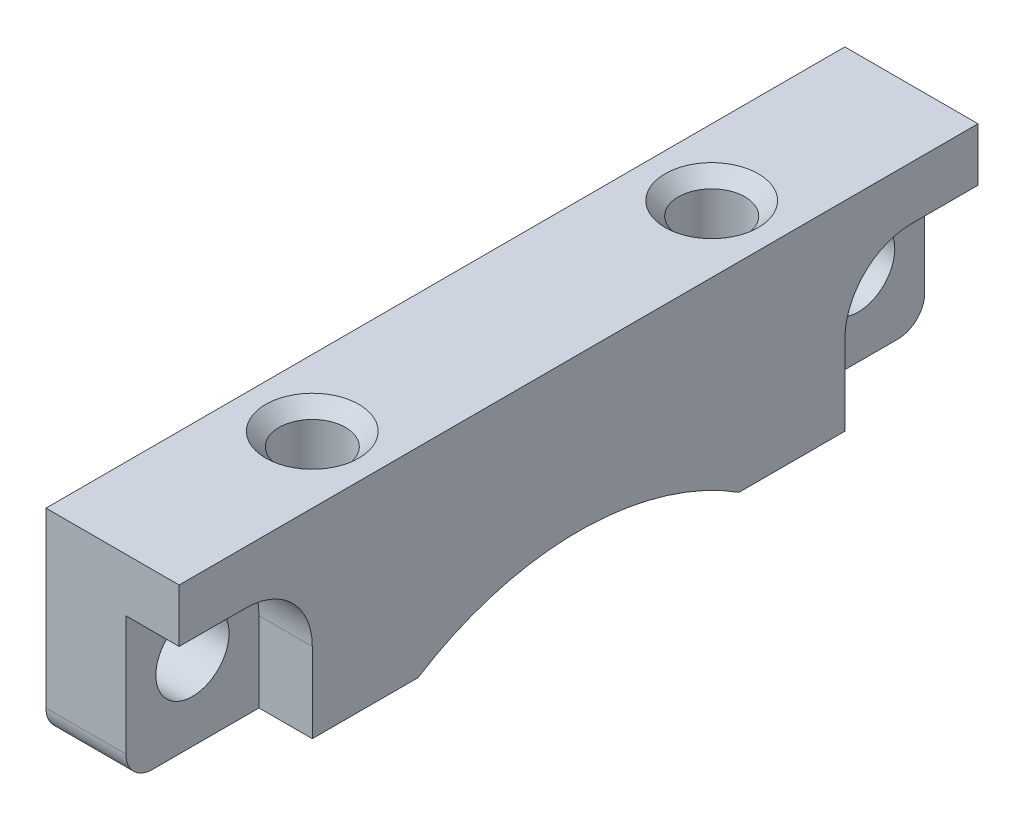
ISO-10303-21;
HEADER;
FILE_DESCRIPTION(('STEP AP214'),'2;1');
FILE_NAME('part.step','',(''),(''),'','','');
FILE_SCHEMA(('AUTOMOTIVE_DESIGN { 1 0 10303 214 1 1 1 1 }'));
ENDSEC;
DATA;
#1=APPLICATION_CONTEXT('core data for automotive mechanical design processes');
#2=APPLICATION_PROTOCOL_DEFINITION('international standard','automotive_design',2000,#1);
#3=PRODUCT_CONTEXT('',#1,'mechanical');
#4=PRODUCT('Part','Part','',(#3));
#5=PRODUCT_RELATED_PRODUCT_CATEGORY('part','',(#4));
#6=PRODUCT_DEFINITION_FORMATION('','',#4);
#7=PRODUCT_DEFINITION_CONTEXT('part definition',#1,'design');
#8=PRODUCT_DEFINITION('design','',#6,#7);
#9=PRODUCT_DEFINITION_SHAPE('','',#8);
#10=(LENGTH_UNIT() NAMED_UNIT(*) SI_UNIT(.MILLI.,.METRE.));
#11=(NAMED_UNIT(*) PLANE_ANGLE_UNIT() SI_UNIT($,.RADIAN.));
#12=(NAMED_UNIT(*) SI_UNIT($,.STERADIAN.) SOLID_ANGLE_UNIT());
#13=UNCERTAINTY_MEASURE_WITH_UNIT(LENGTH_MEASURE(1.E-05),#10,'distance_accuracy_value','');
#14=(GEOMETRIC_REPRESENTATION_CONTEXT(3) GLOBAL_UNCERTAINTY_ASSIGNED_CONTEXT((#13)) GLOBAL_UNIT_ASSIGNED_CONTEXT((#10,
#11,#12)) REPRESENTATION_CONTEXT('',''));
#15=CARTESIAN_POINT('',(0.,0.,0.));
#16=DIRECTION('',(0.,0.,1.));
#17=DIRECTION('',(1.,0.,0.));
#18=AXIS2_PLACEMENT_3D('',#15,#16,#17);
#19=CARTESIAN_POINT('',(10.,25.,25.));
#20=DIRECTION('',(1.,0.,0.));
#21=DIRECTION('',(0.,0.,-1.));
#22=AXIS2_PLACEMENT_3D('',#19,#20,#21);
#23=CYLINDRICAL_SURFACE('',#22,2.74999999999999);
#24=CARTESIAN_POINT('',(0.,25.,25.));
#25=DIRECTION('',(1.,0.,0.));
#26=DIRECTION('',(0.,0.,-1.));
#27=AXIS2_PLACEMENT_3D('',#24,#25,#26);
#28=CIRCLE('',#27,2.75);
#29=CARTESIAN_POINT('',(0.,25.,22.25));
#30=VERTEX_POINT('',#29);
#31=EDGE_CURVE('E289',#30,#30,#28,.T.);
#32=ORIENTED_EDGE('',*,*,#31,.F.);
#33=EDGE_LOOP('',(#32));
#34=FACE_BOUND('',#33,.T.);
#35=CARTESIAN_POINT('',(6.,25.,25.));
#36=DIRECTION('',(1.,0.,0.));
#37=DIRECTION('',(0.,0.,-1.));
#38=AXIS2_PLACEMENT_3D('',#35,#36,#37);
#39=CIRCLE('',#38,2.74999999999999);
#40=CARTESIAN_POINT('',(6.,25.,22.25));
#41=VERTEX_POINT('',#40);
#42=EDGE_CURVE('E217',#41,#41,#39,.F.);
#43=ORIENTED_EDGE('',*,*,#42,.F.);
#44=EDGE_LOOP('',(#43));
#45=FACE_BOUND('',#44,.T.);
#46=ADVANCED_FACE('F57',(#34,#45),#23,.F.);
#47=CARTESIAN_POINT('',(10.,-30.,30.));
#48=DIRECTION('',(0.,0.,-1.));
#49=DIRECTION('',(0.,1.,0.));
#50=AXIS2_PLACEMENT_3D('',#47,#48,#49);
#51=PLANE('',#50);
#52=DIRECTION('',(0.,-1.,0.));
#53=VECTOR('',#52,1.);
#54=CARTESIAN_POINT('',(0.,-30.,30.));
#55=LINE('',#54,#53);
#56=CARTESIAN_POINT('',(0.,34.,30.));
#57=VERTEX_POINT('',#56);
#58=CARTESIAN_POINT('',(0.,21.,30.));
#59=VERTEX_POINT('',#58);
#60=EDGE_CURVE('E311',#57,#59,#55,.T.);
#61=ORIENTED_EDGE('',*,*,#60,.T.);
#62=DIRECTION('',(1.,0.,0.));
#63=VECTOR('',#62,1.);
#64=CARTESIAN_POINT('',(10.,21.,30.));
#65=LINE('',#64,#63);
#66=CARTESIAN_POINT('',(6.,21.,30.));
#67=VERTEX_POINT('',#66);
#68=EDGE_CURVE('E373',#59,#67,#65,.T.);
#69=ORIENTED_EDGE('',*,*,#68,.T.);
#70=DIRECTION('',(0.,-1.,0.));
#71=VECTOR('',#70,1.);
#72=CARTESIAN_POINT('',(6.,30.,30.));
#73=LINE('',#72,#71);
#74=CARTESIAN_POINT('',(6.,30.,30.));
#75=VERTEX_POINT('',#74);
#76=EDGE_CURVE('E189',#75,#67,#73,.T.);
#77=ORIENTED_EDGE('',*,*,#76,.F.);
#78=DIRECTION('',(1.,0.,0.));
#79=VECTOR('',#78,1.);
#80=CARTESIAN_POINT('',(6.,30.,30.));
#81=LINE('',#80,#79);
#82=CARTESIAN_POINT('',(10.,30.,30.));
#83=VERTEX_POINT('',#82);
#84=EDGE_CURVE('E180',#75,#83,#81,.T.);
#85=ORIENTED_EDGE('',*,*,#84,.T.);
#86=DIRECTION('',(0.,-1.,0.));
#87=VECTOR('',#86,1.);
#88=CARTESIAN_POINT('',(10.,-30.,30.));
#89=LINE('',#88,#87);
#90=CARTESIAN_POINT('',(10.,34.,30.));
#91=VERTEX_POINT('',#90);
#92=EDGE_CURVE('E316',#91,#83,#89,.T.);
#93=ORIENTED_EDGE('',*,*,#92,.F.);
#94=DIRECTION('',(-1.,0.,0.));
#95=VECTOR('',#94,1.);
#96=CARTESIAN_POINT('',(10.,34.,30.));
#97=LINE('',#96,#95);
#98=EDGE_CURVE('E327',#91,#57,#97,.T.);
#99=ORIENTED_EDGE('',*,*,#98,.T.);
#100=EDGE_LOOP('',(#61,#69,#77,#85,#93,#99));
#101=FACE_BOUND('',#100,.T.);
#102=ADVANCED_FACE('F436',(#101),#51,.F.);
#103=CARTESIAN_POINT('',(10.,-30.,-30.));
#104=DIRECTION('',(0.,0.,1.));
#105=DIRECTION('',(1.,0.,0.));
#106=AXIS2_PLACEMENT_3D('',#103,#104,#105);
#107=PLANE('',#106);
#108=DIRECTION('',(0.,1.,0.));
#109=VECTOR('',#108,1.);
#110=CARTESIAN_POINT('',(6.,30.,-30.));
#111=LINE('',#110,#109);
#112=CARTESIAN_POINT('',(6.,21.,-30.));
#113=VERTEX_POINT('',#112);
#114=CARTESIAN_POINT('',(6.,30.,-30.));
#115=VERTEX_POINT('',#114);
#116=EDGE_CURVE('E251',#113,#115,#111,.T.);
#117=ORIENTED_EDGE('',*,*,#116,.F.);
#118=DIRECTION('',(-1.,0.,0.));
#119=VECTOR('',#118,1.);
#120=CARTESIAN_POINT('',(10.,21.,-30.));
#121=LINE('',#120,#119);
#122=CARTESIAN_POINT('',(0.,21.,-30.));
#123=VERTEX_POINT('',#122);
#124=EDGE_CURVE('E351',#113,#123,#121,.T.);
#125=ORIENTED_EDGE('',*,*,#124,.T.);
#126=DIRECTION('',(0.,1.,0.));
#127=VECTOR('',#126,1.);
#128=CARTESIAN_POINT('',(0.,-30.,-30.));
#129=LINE('',#128,#127);
#130=CARTESIAN_POINT('',(0.,34.,-30.));
#131=VERTEX_POINT('',#130);
#132=EDGE_CURVE('E331',#123,#131,#129,.T.);
#133=ORIENTED_EDGE('',*,*,#132,.T.);
#134=DIRECTION('',(-1.,0.,0.));
#135=VECTOR('',#134,1.);
#136=CARTESIAN_POINT('',(10.,34.,-30.));
#137=LINE('',#136,#135);
#138=CARTESIAN_POINT('',(10.,34.,-30.));
#139=VERTEX_POINT('',#138);
#140=EDGE_CURVE('E339',#139,#131,#137,.T.);
#141=ORIENTED_EDGE('',*,*,#140,.F.);
#142=DIRECTION('',(0.,1.,0.));
#143=VECTOR('',#142,1.);
#144=CARTESIAN_POINT('',(10.,-30.,-30.));
#145=LINE('',#144,#143);
#146=CARTESIAN_POINT('',(10.,30.,-30.));
#147=VERTEX_POINT('',#146);
#148=EDGE_CURVE('E320',#147,#139,#145,.T.);
#149=ORIENTED_EDGE('',*,*,#148,.F.);
#150=DIRECTION('',(1.,0.,0.));
#151=VECTOR('',#150,1.);
#152=CARTESIAN_POINT('',(6.,30.,-30.));
#153=LINE('',#152,#151);
#154=EDGE_CURVE('E231',#115,#147,#153,.T.);
#155=ORIENTED_EDGE('',*,*,#154,.F.);
#156=EDGE_LOOP('',(#117,#125,#133,#141,#149,#155));
#157=FACE_BOUND('',#156,.T.);
#158=ADVANCED_FACE('F413',(#157),#107,.F.);
#159=CARTESIAN_POINT('',(10.,34.,-30.));
#160=DIRECTION('',(0.,-1.,0.));
#161=DIRECTION('',(0.,0.,-1.));
#162=AXIS2_PLACEMENT_3D('',#159,#160,#161);
#163=PLANE('',#162);
#164=CARTESIAN_POINT('',(5.,34.,-15.));
#165=DIRECTION('',(0.,1.,0.));
#166=DIRECTION('',(0.,0.,1.));
#167=AXIS2_PLACEMENT_3D('',#164,#165,#166);
#168=CIRCLE('',#167,3.5);
#169=CARTESIAN_POINT('',(5.,34.,-11.5));
#170=VERTEX_POINT('',#169);
#171=EDGE_CURVE('E264',#170,#170,#168,.T.);
#172=ORIENTED_EDGE('',*,*,#171,.F.);
#173=EDGE_LOOP('',(#172));
#174=FACE_BOUND('',#173,.T.);
#175=CARTESIAN_POINT('',(5.,34.,15.));
#176=DIRECTION('',(0.,1.,0.));
#177=DIRECTION('',(0.,0.,1.));
#178=AXIS2_PLACEMENT_3D('',#175,#176,#177);
#179=CIRCLE('',#178,3.5);
#180=CARTESIAN_POINT('',(5.,34.,18.5));
#181=VERTEX_POINT('',#180);
#182=EDGE_CURVE('E277',#181,#181,#179,.T.);
#183=ORIENTED_EDGE('',*,*,#182,.F.);
#184=EDGE_LOOP('',(#183));
#185=FACE_BOUND('',#184,.T.);
#186=DIRECTION('',(0.,0.,1.));
#187=VECTOR('',#186,1.);
#188=CARTESIAN_POINT('',(0.,34.,-30.));
#189=LINE('',#188,#187);
#190=EDGE_CURVE('E321',#131,#57,#189,.T.);
#191=ORIENTED_EDGE('',*,*,#190,.T.);
#192=ORIENTED_EDGE('',*,*,#98,.F.);
#193=DIRECTION('',(0.,0.,1.));
#194=VECTOR('',#193,1.);
#195=CARTESIAN_POINT('',(10.,34.,-30.));
#196=LINE('',#195,#194);
#197=EDGE_CURVE('E324',#139,#91,#196,.T.);
#198=ORIENTED_EDGE('',*,*,#197,.F.);
#199=ORIENTED_EDGE('',*,*,#140,.T.);
#200=EDGE_LOOP('',(#191,#192,#198,#199));
#201=FACE_BOUND('',#200,.T.);
#202=ADVANCED_FACE('F461',(#174,#185,#201),#163,.F.);
#203=CARTESIAN_POINT('',(10.,0.,0.));
#204=DIRECTION('',(1.,0.,0.));
#205=DIRECTION('',(0.,0.,-1.));
#206=AXIS2_PLACEMENT_3D('',#203,#204,#205);
#207=PLANE('',#206);
#208=DIRECTION('',(0.,1.,0.));
#209=VECTOR('',#208,1.);
#210=CARTESIAN_POINT('',(10.,25.,20.));
#211=LINE('',#210,#209);
#212=CARTESIAN_POINT('',(10.,19.,20.));
#213=VERTEX_POINT('',#212);
#214=CARTESIAN_POINT('',(10.,25.,20.));
#215=VERTEX_POINT('',#214);
#216=EDGE_CURVE('E195',#213,#215,#211,.T.);
#217=ORIENTED_EDGE('',*,*,#216,.F.);
#218=DIRECTION('',(0.,0.,1.));
#219=VECTOR('',#218,1.);
#220=CARTESIAN_POINT('',(10.,19.,34.7900430724499));
#221=LINE('',#220,#219);
#222=CARTESIAN_POINT('',(10.,19.,12.0519707931939));
#223=VERTEX_POINT('',#222);
#224=EDGE_CURVE('E297',#223,#213,#221,.T.);
#225=ORIENTED_EDGE('',*,*,#224,.F.);
#226=CARTESIAN_POINT('',(10.,0.,0.));
#227=DIRECTION('',(-1.,0.,0.));
#228=DIRECTION('',(0.,0.,1.));
#229=AXIS2_PLACEMENT_3D('',#226,#227,#228);
#230=CIRCLE('',#229,22.5);
#231=CARTESIAN_POINT('',(10.,19.,-12.0519707931939));
#232=VERTEX_POINT('',#231);
#233=EDGE_CURVE('E307',#223,#232,#230,.T.);
#234=ORIENTED_EDGE('',*,*,#233,.T.);
#235=CARTESIAN_POINT('',(10.,19.,-20.));
#236=VERTEX_POINT('',#235);
#237=EDGE_CURVE('E303',#236,#232,#221,.T.);
#238=ORIENTED_EDGE('',*,*,#237,.F.);
#239=DIRECTION('',(0.,-1.,0.));
#240=VECTOR('',#239,1.);
#241=CARTESIAN_POINT('',(10.,25.,-20.));
#242=LINE('',#241,#240);
#243=CARTESIAN_POINT('',(10.,25.,-20.));
#244=VERTEX_POINT('',#243);
#245=EDGE_CURVE('E241',#244,#236,#242,.T.);
#246=ORIENTED_EDGE('',*,*,#245,.F.);
#247=CARTESIAN_POINT('',(10.,25.,-25.));
#248=DIRECTION('',(1.,0.,0.));
#249=DIRECTION('',(0.,0.,1.));
#250=AXIS2_PLACEMENT_3D('',#247,#248,#249);
#251=CIRCLE('',#250,5.);
#252=CARTESIAN_POINT('',(10.,30.,-25.));
#253=VERTEX_POINT('',#252);
#254=EDGE_CURVE('E211',#253,#244,#251,.T.);
#255=ORIENTED_EDGE('',*,*,#254,.F.);
#256=DIRECTION('',(0.,0.,1.));
#257=VECTOR('',#256,1.);
#258=CARTESIAN_POINT('',(10.,30.,-25.));
#259=LINE('',#258,#257);
#260=EDGE_CURVE('E237',#147,#253,#259,.T.);
#261=ORIENTED_EDGE('',*,*,#260,.F.);
#262=ORIENTED_EDGE('',*,*,#148,.T.);
#263=ORIENTED_EDGE('',*,*,#197,.T.);
#264=ORIENTED_EDGE('',*,*,#92,.T.);
#265=DIRECTION('',(0.,0.,1.));
#266=VECTOR('',#265,1.);
#267=CARTESIAN_POINT('',(10.,30.,25.));
#268=LINE('',#267,#266);
#269=CARTESIAN_POINT('',(10.,30.,25.));
#270=VERTEX_POINT('',#269);
#271=EDGE_CURVE('E199',#270,#83,#268,.T.);
#272=ORIENTED_EDGE('',*,*,#271,.F.);
#273=CARTESIAN_POINT('',(10.,25.,25.));
#274=DIRECTION('',(1.,0.,0.));
#275=DIRECTION('',(0.,0.,-1.));
#276=AXIS2_PLACEMENT_3D('',#273,#274,#275);
#277=CIRCLE('',#276,5.);
#278=EDGE_CURVE('E176',#215,#270,#277,.T.);
#279=ORIENTED_EDGE('',*,*,#278,.F.);
#280=EDGE_LOOP('',(#217,#225,#234,#238,#246,#255,#261,#262,#263,#264,#272,#279));
#281=FACE_BOUND('',#280,.T.);
#282=ADVANCED_FACE('F393',(#281),#207,.T.);
#283=CARTESIAN_POINT('',(0.,0.,0.));
#284=DIRECTION('',(1.,0.,0.));
#285=DIRECTION('',(0.,0.,-1.));
#286=AXIS2_PLACEMENT_3D('',#283,#284,#285);
#287=PLANE('',#286);
#288=ORIENTED_EDGE('',*,*,#31,.T.);
#289=EDGE_LOOP('',(#288));
#290=FACE_BOUND('',#289,.T.);
#291=CARTESIAN_POINT('',(0.,25.,-25.));
#292=DIRECTION('',(1.,0.,0.));
#293=DIRECTION('',(0.,0.,-1.));
#294=AXIS2_PLACEMENT_3D('',#291,#292,#293);
#295=CIRCLE('',#294,2.75);
#296=CARTESIAN_POINT('',(0.,25.,-27.75));
#297=VERTEX_POINT('',#296);
#298=EDGE_CURVE('E293',#297,#297,#295,.T.);
#299=ORIENTED_EDGE('',*,*,#298,.T.);
#300=EDGE_LOOP('',(#299));
#301=FACE_BOUND('',#300,.T.);
#302=ORIENTED_EDGE('',*,*,#132,.F.);
#303=CARTESIAN_POINT('',(0.,21.,-28.));
#304=DIRECTION('',(1.,0.,0.));
#305=DIRECTION('',(0.,0.,-1.));
#306=AXIS2_PLACEMENT_3D('',#303,#304,#305);
#307=CIRCLE('',#306,2.);
#308=CARTESIAN_POINT('',(0.,19.,-28.));
#309=VERTEX_POINT('',#308);
#310=EDGE_CURVE('E364',#123,#309,#307,.F.);
#311=ORIENTED_EDGE('',*,*,#310,.T.);
#312=DIRECTION('',(0.,0.,1.));
#313=VECTOR('',#312,1.);
#314=CARTESIAN_POINT('',(0.,19.,34.7900430724499));
#315=LINE('',#314,#313);
#316=CARTESIAN_POINT('',(0.,19.,-12.0519707931939));
#317=VERTEX_POINT('',#316);
#318=EDGE_CURVE('E302',#309,#317,#315,.T.);
#319=ORIENTED_EDGE('',*,*,#318,.T.);
#320=CARTESIAN_POINT('',(0.,0.,0.));
#321=DIRECTION('',(-1.,0.,0.));
#322=DIRECTION('',(0.,0.,1.));
#323=AXIS2_PLACEMENT_3D('',#320,#321,#322);
#324=CIRCLE('',#323,22.5);
#325=CARTESIAN_POINT('',(0.,19.,12.0519707931939));
#326=VERTEX_POINT('',#325);
#327=EDGE_CURVE('E312',#326,#317,#324,.T.);
#328=ORIENTED_EDGE('',*,*,#327,.F.);
#329=CARTESIAN_POINT('',(0.,19.,28.));
#330=VERTEX_POINT('',#329);
#331=EDGE_CURVE('E298',#326,#330,#315,.T.);
#332=ORIENTED_EDGE('',*,*,#331,.T.);
#333=CARTESIAN_POINT('',(0.,21.,28.));
#334=DIRECTION('',(1.,0.,0.));
#335=DIRECTION('',(0.,0.,-1.));
#336=AXIS2_PLACEMENT_3D('',#333,#334,#335);
#337=CIRCLE('',#336,2.);
#338=EDGE_CURVE('E361',#330,#59,#337,.F.);
#339=ORIENTED_EDGE('',*,*,#338,.T.);
#340=ORIENTED_EDGE('',*,*,#60,.F.);
#341=ORIENTED_EDGE('',*,*,#190,.F.);
#342=EDGE_LOOP('',(#302,#311,#319,#328,#332,#339,#340,#341));
#343=FACE_BOUND('',#342,.T.);
#344=ADVANCED_FACE('F399',(#290,#301,#343),#287,.F.);
#345=CARTESIAN_POINT('',(10.,0.,0.));
#346=DIRECTION('',(-1.,0.,0.));
#347=DIRECTION('',(0.,0.,1.));
#348=AXIS2_PLACEMENT_3D('',#345,#346,#347);
#349=CYLINDRICAL_SURFACE('',#348,22.5);
#350=ORIENTED_EDGE('',*,*,#327,.T.);
#351=DIRECTION('',(-1.,0.,0.));
#352=VECTOR('',#351,1.);
#353=CARTESIAN_POINT('',(10.,19.,-12.0519707931939));
#354=LINE('',#353,#352);
#355=EDGE_CURVE('E347',#317,#232,#354,.F.);
#356=ORIENTED_EDGE('',*,*,#355,.T.);
#357=ORIENTED_EDGE('',*,*,#233,.F.);
#358=DIRECTION('',(-1.,0.,0.));
#359=VECTOR('',#358,1.);
#360=CARTESIAN_POINT('',(10.,19.,12.0519707931939));
#361=LINE('',#360,#359);
#362=EDGE_CURVE('E343',#223,#326,#361,.T.);
#363=ORIENTED_EDGE('',*,*,#362,.T.);
#364=EDGE_LOOP('',(#350,#356,#357,#363));
#365=FACE_BOUND('',#364,.T.);
#366=ADVANCED_FACE('F389',(#365),#349,.F.);
#367=CARTESIAN_POINT('',(0.,19.,34.7900430724499));
#368=DIRECTION('',(0.,1.,0.));
#369=DIRECTION('',(0.,0.,1.));
#370=AXIS2_PLACEMENT_3D('',#367,#368,#369);
#371=PLANE('',#370);
#372=CARTESIAN_POINT('',(5.,19.,15.));
#373=DIRECTION('',(0.,1.,0.));
#374=DIRECTION('',(0.,0.,1.));
#375=AXIS2_PLACEMENT_3D('',#372,#373,#374);
#376=CIRCLE('',#375,2.5);
#377=CARTESIAN_POINT('',(5.,19.,17.5));
#378=VERTEX_POINT('',#377);
#379=EDGE_CURVE('E285',#378,#378,#376,.T.);
#380=ORIENTED_EDGE('',*,*,#379,.T.);
#381=EDGE_LOOP('',(#380));
#382=FACE_BOUND('',#381,.T.);
#383=DIRECTION('',(0.,0.,-1.));
#384=VECTOR('',#383,1.);
#385=CARTESIAN_POINT('',(6.,19.,20.));
#386=LINE('',#385,#384);
#387=CARTESIAN_POINT('',(6.,19.,28.));
#388=VERTEX_POINT('',#387);
#389=CARTESIAN_POINT('',(6.,19.,20.));
#390=VERTEX_POINT('',#389);
#391=EDGE_CURVE('E204',#388,#390,#386,.T.);
#392=ORIENTED_EDGE('',*,*,#391,.F.);
#393=DIRECTION('',(1.,0.,0.));
#394=VECTOR('',#393,1.);
#395=CARTESIAN_POINT('',(0.,19.,28.));
#396=LINE('',#395,#394);
#397=EDGE_CURVE('E11',#388,#330,#396,.F.);
#398=ORIENTED_EDGE('',*,*,#397,.T.);
#399=ORIENTED_EDGE('',*,*,#331,.F.);
#400=ORIENTED_EDGE('',*,*,#362,.F.);
#401=ORIENTED_EDGE('',*,*,#224,.T.);
#402=DIRECTION('',(1.,0.,0.));
#403=VECTOR('',#402,1.);
#404=CARTESIAN_POINT('',(6.,19.,20.));
#405=LINE('',#404,#403);
#406=EDGE_CURVE('E218',#390,#213,#405,.T.);
#407=ORIENTED_EDGE('',*,*,#406,.F.);
#408=EDGE_LOOP('',(#392,#398,#399,#400,#401,#407));
#409=FACE_BOUND('',#408,.T.);
#410=ADVANCED_FACE('F396',(#382,#409),#371,.F.);
#411=CARTESIAN_POINT('',(5.,19.,-15.));
#412=DIRECTION('',(0.,1.,0.));
#413=DIRECTION('',(0.,0.,1.));
#414=AXIS2_PLACEMENT_3D('',#411,#412,#413);
#415=CIRCLE('',#414,2.5);
#416=CARTESIAN_POINT('',(5.,19.,-12.5));
#417=VERTEX_POINT('',#416);
#418=EDGE_CURVE('E273',#417,#417,#415,.T.);
#419=ORIENTED_EDGE('',*,*,#418,.T.);
#420=EDGE_LOOP('',(#419));
#421=FACE_BOUND('',#420,.T.);
#422=ORIENTED_EDGE('',*,*,#318,.F.);
#423=DIRECTION('',(-1.,0.,0.));
#424=VECTOR('',#423,1.);
#425=CARTESIAN_POINT('',(0.,19.,-28.));
#426=LINE('',#425,#424);
#427=CARTESIAN_POINT('',(6.,19.,-28.));
#428=VERTEX_POINT('',#427);
#429=EDGE_CURVE('E367',#309,#428,#426,.F.);
#430=ORIENTED_EDGE('',*,*,#429,.T.);
#431=DIRECTION('',(0.,0.,-1.));
#432=VECTOR('',#431,1.);
#433=CARTESIAN_POINT('',(6.,19.,-20.));
#434=LINE('',#433,#432);
#435=CARTESIAN_POINT('',(6.,19.,-20.));
#436=VERTEX_POINT('',#435);
#437=EDGE_CURVE('E254',#436,#428,#434,.T.);
#438=ORIENTED_EDGE('',*,*,#437,.F.);
#439=DIRECTION('',(1.,0.,0.));
#440=VECTOR('',#439,1.);
#441=CARTESIAN_POINT('',(6.,19.,-20.));
#442=LINE('',#441,#440);
#443=EDGE_CURVE('E227',#436,#236,#442,.T.);
#444=ORIENTED_EDGE('',*,*,#443,.T.);
#445=ORIENTED_EDGE('',*,*,#237,.T.);
#446=ORIENTED_EDGE('',*,*,#355,.F.);
#447=EDGE_LOOP('',(#422,#430,#438,#444,#445,#446));
#448=FACE_BOUND('',#447,.T.);
#449=ADVANCED_FACE('F382',(#421,#448),#371,.F.);
#450=CARTESIAN_POINT('',(10.,25.,-25.));
#451=DIRECTION('',(1.,0.,0.));
#452=DIRECTION('',(0.,0.,-1.));
#453=AXIS2_PLACEMENT_3D('',#450,#451,#452);
#454=CYLINDRICAL_SURFACE('',#453,2.74999999999999);
#455=CARTESIAN_POINT('',(6.,25.,-25.));
#456=DIRECTION('',(-1.,0.,0.));
#457=DIRECTION('',(0.,0.,1.));
#458=AXIS2_PLACEMENT_3D('',#455,#456,#457);
#459=CIRCLE('',#458,2.74999999999999);
#460=CARTESIAN_POINT('',(6.,25.,-22.25));
#461=VERTEX_POINT('',#460);
#462=EDGE_CURVE('E269',#461,#461,#459,.F.);
#463=ORIENTED_EDGE('',*,*,#462,.T.);
#464=EDGE_LOOP('',(#463));
#465=FACE_BOUND('',#464,.T.);
#466=ORIENTED_EDGE('',*,*,#298,.F.);
#467=EDGE_LOOP('',(#466));
#468=FACE_BOUND('',#467,.T.);
#469=ADVANCED_FACE('F451',(#465,#468),#454,.F.);
#470=CARTESIAN_POINT('',(5.,34.,15.));
#471=DIRECTION('',(0.,1.,0.));
#472=DIRECTION('',(0.,0.,1.));
#473=AXIS2_PLACEMENT_3D('',#470,#471,#472);
#474=CYLINDRICAL_SURFACE('',#473,2.5);
#475=ORIENTED_EDGE('',*,*,#379,.F.);
#476=EDGE_LOOP('',(#475));
#477=FACE_BOUND('',#476,.T.);
#478=CARTESIAN_POINT('',(5.,33.,15.));
#479=DIRECTION('',(0.,1.,0.));
#480=DIRECTION('',(0.,0.,1.));
#481=AXIS2_PLACEMENT_3D('',#478,#479,#480);
#482=CIRCLE('',#481,2.5);
#483=CARTESIAN_POINT('',(5.,33.,17.5));
#484=VERTEX_POINT('',#483);
#485=EDGE_CURVE('E281',#484,#484,#482,.T.);
#486=ORIENTED_EDGE('',*,*,#485,.T.);
#487=EDGE_LOOP('',(#486));
#488=FACE_BOUND('',#487,.T.);
#489=ADVANCED_FACE('F449',(#477,#488),#474,.F.);
#490=CARTESIAN_POINT('',(5.,34.,15.));
#491=DIRECTION('',(0.,1.,0.));
#492=DIRECTION('',(0.,0.,1.));
#493=AXIS2_PLACEMENT_3D('',#490,#491,#492);
#494=CONICAL_SURFACE('',#493,3.5,0.785398163397449);
#495=ORIENTED_EDGE('',*,*,#485,.F.);
#496=EDGE_LOOP('',(#495));
#497=FACE_BOUND('',#496,.T.);
#498=ORIENTED_EDGE('',*,*,#182,.T.);
#499=EDGE_LOOP('',(#498));
#500=FACE_BOUND('',#499,.T.);
#501=ADVANCED_FACE('F583',(#497,#500),#494,.F.);
#502=CARTESIAN_POINT('',(5.,34.,-15.));
#503=DIRECTION('',(0.,1.,0.));
#504=DIRECTION('',(0.,0.,1.));
#505=AXIS2_PLACEMENT_3D('',#502,#503,#504);
#506=CYLINDRICAL_SURFACE('',#505,2.5);
#507=ORIENTED_EDGE('',*,*,#418,.F.);
#508=EDGE_LOOP('',(#507));
#509=FACE_BOUND('',#508,.T.);
#510=CARTESIAN_POINT('',(5.,33.,-15.));
#511=DIRECTION('',(0.,1.,0.));
#512=DIRECTION('',(0.,0.,1.));
#513=AXIS2_PLACEMENT_3D('',#510,#511,#512);
#514=CIRCLE('',#513,2.5);
#515=CARTESIAN_POINT('',(5.,33.,-12.5));
#516=VERTEX_POINT('',#515);
#517=EDGE_CURVE('E268',#516,#516,#514,.T.);
#518=ORIENTED_EDGE('',*,*,#517,.T.);
#519=EDGE_LOOP('',(#518));
#520=FACE_BOUND('',#519,.T.);
#521=ADVANCED_FACE('F574',(#509,#520),#506,.F.);
#522=CARTESIAN_POINT('',(5.,34.,-15.));
#523=DIRECTION('',(0.,1.,0.));
#524=DIRECTION('',(0.,0.,1.));
#525=AXIS2_PLACEMENT_3D('',#522,#523,#524);
#526=CONICAL_SURFACE('',#525,3.5,0.785398163397449);
#527=ORIENTED_EDGE('',*,*,#517,.F.);
#528=EDGE_LOOP('',(#527));
#529=FACE_BOUND('',#528,.T.);
#530=ORIENTED_EDGE('',*,*,#171,.T.);
#531=EDGE_LOOP('',(#530));
#532=FACE_BOUND('',#531,.T.);
#533=ADVANCED_FACE('F501',(#529,#532),#526,.F.);
#534=CARTESIAN_POINT('',(6.,25.,25.));
#535=DIRECTION('',(1.,0.,0.));
#536=DIRECTION('',(0.,0.,-1.));
#537=AXIS2_PLACEMENT_3D('',#534,#535,#536);
#538=PLANE('',#537);
#539=ORIENTED_EDGE('',*,*,#76,.T.);
#540=CARTESIAN_POINT('',(6.,21.,28.));
#541=DIRECTION('',(1.,0.,0.));
#542=DIRECTION('',(0.,0.,-1.));
#543=AXIS2_PLACEMENT_3D('',#540,#541,#542);
#544=CIRCLE('',#543,2.);
#545=EDGE_CURVE('E66',#67,#388,#544,.T.);
#546=ORIENTED_EDGE('',*,*,#545,.T.);
#547=ORIENTED_EDGE('',*,*,#391,.T.);
#548=DIRECTION('',(0.,1.,0.));
#549=VECTOR('',#548,1.);
#550=CARTESIAN_POINT('',(6.,25.,20.));
#551=LINE('',#550,#549);
#552=CARTESIAN_POINT('',(6.,25.,20.));
#553=VERTEX_POINT('',#552);
#554=EDGE_CURVE('E181',#390,#553,#551,.T.);
#555=ORIENTED_EDGE('',*,*,#554,.T.);
#556=CARTESIAN_POINT('',(6.,25.,25.));
#557=DIRECTION('',(1.,0.,0.));
#558=DIRECTION('',(0.,0.,-1.));
#559=AXIS2_PLACEMENT_3D('',#556,#557,#558);
#560=CIRCLE('',#559,5.);
#561=CARTESIAN_POINT('',(6.,30.,25.));
#562=VERTEX_POINT('',#561);
#563=EDGE_CURVE('E173',#553,#562,#560,.T.);
#564=ORIENTED_EDGE('',*,*,#563,.T.);
#565=DIRECTION('',(0.,0.,1.));
#566=VECTOR('',#565,1.);
#567=CARTESIAN_POINT('',(6.,30.,25.));
#568=LINE('',#567,#566);
#569=EDGE_CURVE('E184',#562,#75,#568,.T.);
#570=ORIENTED_EDGE('',*,*,#569,.T.);
#571=EDGE_LOOP('',(#539,#546,#547,#555,#564,#570));
#572=FACE_BOUND('',#571,.T.);
#573=ORIENTED_EDGE('',*,*,#42,.T.);
#574=EDGE_LOOP('',(#573));
#575=FACE_BOUND('',#574,.T.);
#576=ADVANCED_FACE('F191',(#572,#575),#538,.T.);
#577=CARTESIAN_POINT('',(6.,25.,25.));
#578=DIRECTION('',(1.,0.,0.));
#579=DIRECTION('',(0.,0.,-1.));
#580=AXIS2_PLACEMENT_3D('',#577,#578,#579);
#581=CYLINDRICAL_SURFACE('',#580,5.);
#582=ORIENTED_EDGE('',*,*,#278,.T.);
#583=DIRECTION('',(1.,0.,0.));
#584=VECTOR('',#583,1.);
#585=CARTESIAN_POINT('',(6.,30.,25.));
#586=LINE('',#585,#584);
#587=EDGE_CURVE('E169',#562,#270,#586,.T.);
#588=ORIENTED_EDGE('',*,*,#587,.F.);
#589=ORIENTED_EDGE('',*,*,#563,.F.);
#590=DIRECTION('',(1.,0.,0.));
#591=VECTOR('',#590,1.);
#592=CARTESIAN_POINT('',(6.,25.,20.));
#593=LINE('',#592,#591);
#594=EDGE_CURVE('E214',#553,#215,#593,.T.);
#595=ORIENTED_EDGE('',*,*,#594,.T.);
#596=EDGE_LOOP('',(#582,#588,#589,#595));
#597=FACE_BOUND('',#596,.T.);
#598=ADVANCED_FACE('F171',(#597),#581,.F.);
#599=CARTESIAN_POINT('',(6.,25.,20.));
#600=DIRECTION('',(0.,0.,-1.));
#601=DIRECTION('',(-1.,0.,0.));
#602=AXIS2_PLACEMENT_3D('',#599,#600,#601);
#603=PLANE('',#602);
#604=ORIENTED_EDGE('',*,*,#216,.T.);
#605=ORIENTED_EDGE('',*,*,#594,.F.);
#606=ORIENTED_EDGE('',*,*,#554,.F.);
#607=ORIENTED_EDGE('',*,*,#406,.T.);
#608=EDGE_LOOP('',(#604,#605,#606,#607));
#609=FACE_BOUND('',#608,.T.);
#610=ADVANCED_FACE('F548',(#609),#603,.F.);
#611=CARTESIAN_POINT('',(6.,30.,25.));
#612=DIRECTION('',(0.,1.,0.));
#613=DIRECTION('',(0.,0.,1.));
#614=AXIS2_PLACEMENT_3D('',#611,#612,#613);
#615=PLANE('',#614);
#616=ORIENTED_EDGE('',*,*,#271,.T.);
#617=ORIENTED_EDGE('',*,*,#84,.F.);
#618=ORIENTED_EDGE('',*,*,#569,.F.);
#619=ORIENTED_EDGE('',*,*,#587,.T.);
#620=EDGE_LOOP('',(#616,#617,#618,#619));
#621=FACE_BOUND('',#620,.T.);
#622=ADVANCED_FACE('F185',(#621),#615,.F.);
#623=CARTESIAN_POINT('',(6.,25.,-25.));
#624=DIRECTION('',(-1.,0.,0.));
#625=DIRECTION('',(0.,0.,1.));
#626=AXIS2_PLACEMENT_3D('',#623,#624,#625);
#627=PLANE('',#626);
#628=ORIENTED_EDGE('',*,*,#437,.T.);
#629=CARTESIAN_POINT('',(6.,21.,-28.));
#630=DIRECTION('',(-1.,0.,0.));
#631=DIRECTION('',(0.,0.,1.));
#632=AXIS2_PLACEMENT_3D('',#629,#630,#631);
#633=CIRCLE('',#632,2.);
#634=EDGE_CURVE('E370',#428,#113,#633,.F.);
#635=ORIENTED_EDGE('',*,*,#634,.T.);
#636=ORIENTED_EDGE('',*,*,#116,.T.);
#637=DIRECTION('',(0.,0.,1.));
#638=VECTOR('',#637,1.);
#639=CARTESIAN_POINT('',(6.,30.,-25.));
#640=LINE('',#639,#638);
#641=CARTESIAN_POINT('',(6.,30.,-25.));
#642=VERTEX_POINT('',#641);
#643=EDGE_CURVE('E226',#115,#642,#640,.T.);
#644=ORIENTED_EDGE('',*,*,#643,.T.);
#645=CARTESIAN_POINT('',(6.,25.,-25.));
#646=DIRECTION('',(1.,0.,0.));
#647=DIRECTION('',(0.,0.,1.));
#648=AXIS2_PLACEMENT_3D('',#645,#646,#647);
#649=CIRCLE('',#648,5.);
#650=CARTESIAN_POINT('',(6.,25.,-20.));
#651=VERTEX_POINT('',#650);
#652=EDGE_CURVE('E242',#642,#651,#649,.T.);
#653=ORIENTED_EDGE('',*,*,#652,.T.);
#654=DIRECTION('',(0.,-1.,0.));
#655=VECTOR('',#654,1.);
#656=CARTESIAN_POINT('',(6.,25.,-20.));
#657=LINE('',#656,#655);
#658=EDGE_CURVE('E258',#651,#436,#657,.T.);
#659=ORIENTED_EDGE('',*,*,#658,.T.);
#660=EDGE_LOOP('',(#628,#635,#636,#644,#653,#659));
#661=FACE_BOUND('',#660,.T.);
#662=ORIENTED_EDGE('',*,*,#462,.F.);
#663=EDGE_LOOP('',(#662));
#664=FACE_BOUND('',#663,.T.);
#665=ADVANCED_FACE('F408',(#661,#664),#627,.F.);
#666=CARTESIAN_POINT('',(6.,25.,-25.));
#667=DIRECTION('',(1.,0.,0.));
#668=DIRECTION('',(0.,0.,-1.));
#669=AXIS2_PLACEMENT_3D('',#666,#667,#668);
#670=CYLINDRICAL_SURFACE('',#669,5.);
#671=ORIENTED_EDGE('',*,*,#254,.T.);
#672=DIRECTION('',(1.,0.,0.));
#673=VECTOR('',#672,1.);
#674=CARTESIAN_POINT('',(6.,25.,-20.));
#675=LINE('',#674,#673);
#676=EDGE_CURVE('E223',#651,#244,#675,.T.);
#677=ORIENTED_EDGE('',*,*,#676,.F.);
#678=ORIENTED_EDGE('',*,*,#652,.F.);
#679=DIRECTION('',(1.,0.,0.));
#680=VECTOR('',#679,1.);
#681=CARTESIAN_POINT('',(6.,30.,-25.));
#682=LINE('',#681,#680);
#683=EDGE_CURVE('E234',#642,#253,#682,.T.);
#684=ORIENTED_EDGE('',*,*,#683,.T.);
#685=EDGE_LOOP('',(#671,#677,#678,#684));
#686=FACE_BOUND('',#685,.T.);
#687=ADVANCED_FACE('F421',(#686),#670,.F.);
#688=CARTESIAN_POINT('',(6.,30.,-25.));
#689=DIRECTION('',(0.,1.,0.));
#690=DIRECTION('',(0.,0.,1.));
#691=AXIS2_PLACEMENT_3D('',#688,#689,#690);
#692=PLANE('',#691);
#693=ORIENTED_EDGE('',*,*,#260,.T.);
#694=ORIENTED_EDGE('',*,*,#683,.F.);
#695=ORIENTED_EDGE('',*,*,#643,.F.);
#696=ORIENTED_EDGE('',*,*,#154,.T.);
#697=EDGE_LOOP('',(#693,#694,#695,#696));
#698=FACE_BOUND('',#697,.T.);
#699=ADVANCED_FACE('F418',(#698),#692,.F.);
#700=CARTESIAN_POINT('',(6.,25.,-20.));
#701=DIRECTION('',(0.,0.,1.));
#702=DIRECTION('',(1.,0.,0.));
#703=AXIS2_PLACEMENT_3D('',#700,#701,#702);
#704=PLANE('',#703);
#705=ORIENTED_EDGE('',*,*,#245,.T.);
#706=ORIENTED_EDGE('',*,*,#443,.F.);
#707=ORIENTED_EDGE('',*,*,#658,.F.);
#708=ORIENTED_EDGE('',*,*,#676,.T.);
#709=EDGE_LOOP('',(#705,#706,#707,#708));
#710=FACE_BOUND('',#709,.T.);
#711=ADVANCED_FACE('F425',(#710),#704,.F.);
#712=CARTESIAN_POINT('',(10.,21.,-28.));
#713=DIRECTION('',(-1.,0.,0.));
#714=DIRECTION('',(0.,0.,1.));
#715=AXIS2_PLACEMENT_3D('',#712,#713,#714);
#716=CYLINDRICAL_SURFACE('',#715,2.);
#717=ORIENTED_EDGE('',*,*,#634,.F.);
#718=ORIENTED_EDGE('',*,*,#429,.F.);
#719=ORIENTED_EDGE('',*,*,#310,.F.);
#720=ORIENTED_EDGE('',*,*,#124,.F.);
#721=EDGE_LOOP('',(#717,#718,#719,#720));
#722=FACE_BOUND('',#721,.T.);
#723=ADVANCED_FACE('F404',(#722),#716,.T.);
#724=CARTESIAN_POINT('',(10.,21.,28.));
#725=DIRECTION('',(1.,0.,0.));
#726=DIRECTION('',(0.,0.,-1.));
#727=AXIS2_PLACEMENT_3D('',#724,#725,#726);
#728=CYLINDRICAL_SURFACE('',#727,2.);
#729=ORIENTED_EDGE('',*,*,#338,.F.);
#730=ORIENTED_EDGE('',*,*,#397,.F.);
#731=ORIENTED_EDGE('',*,*,#545,.F.);
#732=ORIENTED_EDGE('',*,*,#68,.F.);
#733=EDGE_LOOP('',(#729,#730,#731,#732));
#734=FACE_BOUND('',#733,.T.);
#735=ADVANCED_FACE('F59',(#734),#728,.T.);
#736=CLOSED_SHELL('',(#46,#102,#158,#202,#282,#344,#366,#410,#449,#469,#489,#501,#521,#533,#576,
#598,#610,#622,#665,#687,#699,#711,#723,#735));
#737=MANIFOLD_SOLID_BREP('B2',#736);
#738=ADVANCED_BREP_SHAPE_REPRESENTATION('',(#18,#737),#14);
#739=SHAPE_DEFINITION_REPRESENTATION(#9,#738);
ENDSEC;
END-ISO-10303-21;
